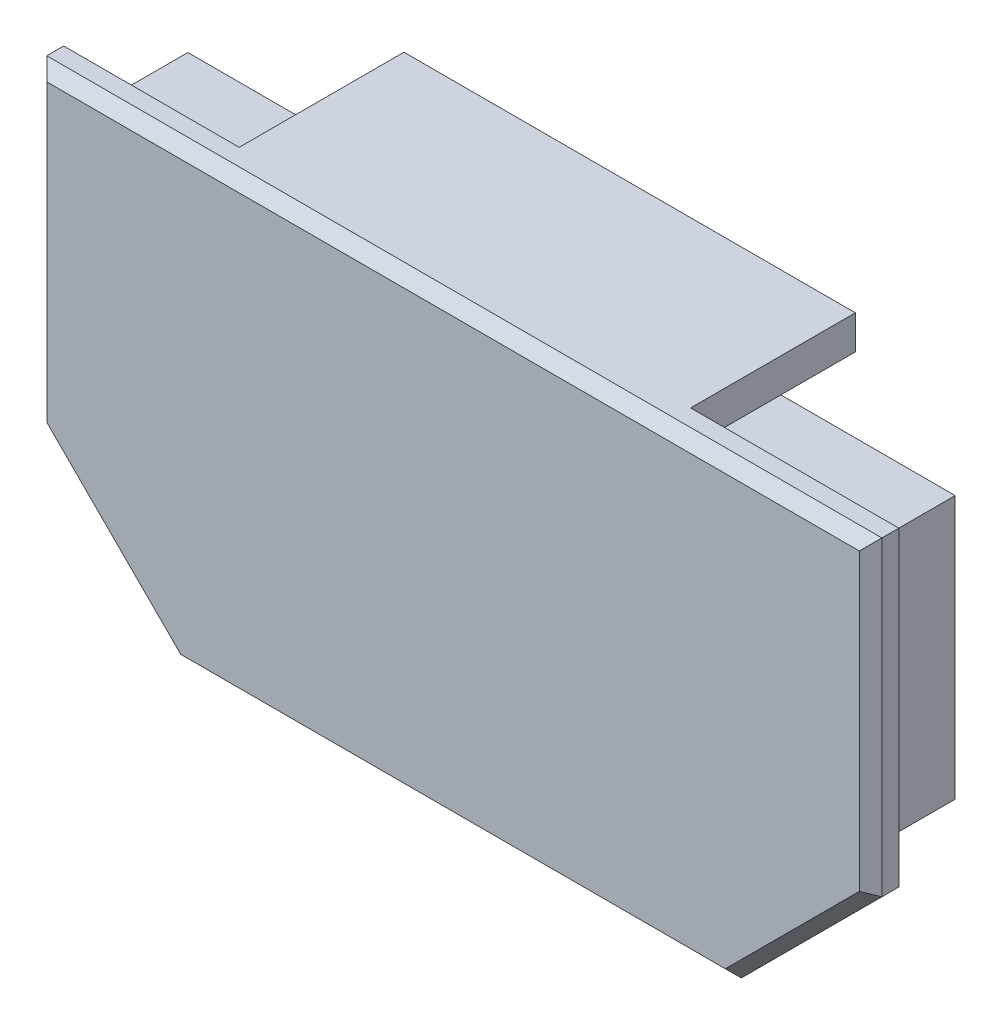
ISO-10303-21;
HEADER;
FILE_DESCRIPTION(('STEP AP214'),'2;1');
FILE_NAME('part.step','',(''),(''),'','','');
FILE_SCHEMA(('AUTOMOTIVE_DESIGN { 1 0 10303 214 1 1 1 1 }'));
ENDSEC;
DATA;
#1=APPLICATION_CONTEXT('core data for automotive mechanical design processes');
#2=APPLICATION_PROTOCOL_DEFINITION('international standard','automotive_design',2000,#1);
#3=PRODUCT_CONTEXT('',#1,'mechanical');
#4=PRODUCT('Part','Part','',(#3));
#5=PRODUCT_RELATED_PRODUCT_CATEGORY('part','',(#4));
#6=PRODUCT_DEFINITION_FORMATION('','',#4);
#7=PRODUCT_DEFINITION_CONTEXT('part definition',#1,'design');
#8=PRODUCT_DEFINITION('design','',#6,#7);
#9=PRODUCT_DEFINITION_SHAPE('','',#8);
#10=(LENGTH_UNIT() NAMED_UNIT(*) SI_UNIT(.MILLI.,.METRE.));
#11=(NAMED_UNIT(*) PLANE_ANGLE_UNIT() SI_UNIT($,.RADIAN.));
#12=(NAMED_UNIT(*) SI_UNIT($,.STERADIAN.) SOLID_ANGLE_UNIT());
#13=UNCERTAINTY_MEASURE_WITH_UNIT(LENGTH_MEASURE(1.E-05),#10,'distance_accuracy_value','');
#14=(GEOMETRIC_REPRESENTATION_CONTEXT(3) GLOBAL_UNCERTAINTY_ASSIGNED_CONTEXT((#13)) GLOBAL_UNIT_ASSIGNED_CONTEXT((#10,
#11,#12)) REPRESENTATION_CONTEXT('',''));
#15=CARTESIAN_POINT('',(0.,0.,0.));
#16=DIRECTION('',(0.,0.,1.));
#17=DIRECTION('',(1.,0.,0.));
#18=AXIS2_PLACEMENT_3D('',#15,#16,#17);
#19=CARTESIAN_POINT('',(-34.,17.,-8.));
#20=DIRECTION('',(0.,1.,0.));
#21=DIRECTION('',(0.,0.,1.));
#22=AXIS2_PLACEMENT_3D('',#19,#20,#21);
#23=PLANE('',#22);
#24=DIRECTION('',(-1.,0.,0.));
#25=VECTOR('',#24,1.);
#26=CARTESIAN_POINT('',(-34.,17.,-8.));
#27=LINE('',#26,#25);
#28=CARTESIAN_POINT('',(34.,17.,-8.));
#29=VERTEX_POINT('',#28);
#30=CARTESIAN_POINT('',(18.55,17.,-8.));
#31=VERTEX_POINT('',#30);
#32=EDGE_CURVE('E389',#29,#31,#27,.T.);
#33=ORIENTED_EDGE('',*,*,#32,.T.);
#34=DIRECTION('',(0.,0.,1.));
#35=VECTOR('',#34,1.);
#36=CARTESIAN_POINT('',(18.55,17.,-14.6));
#37=LINE('',#36,#35);
#38=CARTESIAN_POINT('',(18.55,17.,0.));
#39=VERTEX_POINT('',#38);
#40=EDGE_CURVE('E263',#31,#39,#37,.T.);
#41=ORIENTED_EDGE('',*,*,#40,.T.);
#42=DIRECTION('',(-1.,0.,0.));
#43=VECTOR('',#42,1.);
#44=CARTESIAN_POINT('',(-34.,17.,0.));
#45=LINE('',#44,#43);
#46=CARTESIAN_POINT('',(34.,17.,0.));
#47=VERTEX_POINT('',#46);
#48=EDGE_CURVE('E408',#47,#39,#45,.T.);
#49=ORIENTED_EDGE('',*,*,#48,.F.);
#50=DIRECTION('',(0.,0.,1.));
#51=VECTOR('',#50,1.);
#52=CARTESIAN_POINT('',(34.,17.,-8.));
#53=LINE('',#52,#51);
#54=EDGE_CURVE('E431',#29,#47,#53,.T.);
#55=ORIENTED_EDGE('',*,*,#54,.F.);
#56=EDGE_LOOP('',(#33,#41,#49,#55));
#57=FACE_BOUND('',#56,.T.);
#58=ADVANCED_FACE('F41',(#57),#23,.T.);
#59=CARTESIAN_POINT('',(-21.45,17.,0.));
#60=VERTEX_POINT('',#59);
#61=CARTESIAN_POINT('',(-34.,17.,0.));
#62=VERTEX_POINT('',#61);
#63=EDGE_CURVE('E407',#60,#62,#45,.T.);
#64=ORIENTED_EDGE('',*,*,#63,.F.);
#65=DIRECTION('',(0.,0.,1.));
#66=VECTOR('',#65,1.);
#67=CARTESIAN_POINT('',(-21.45,17.,-14.6));
#68=LINE('',#67,#66);
#69=CARTESIAN_POINT('',(-21.45,17.,-8.));
#70=VERTEX_POINT('',#69);
#71=EDGE_CURVE('E615',#70,#60,#68,.T.);
#72=ORIENTED_EDGE('',*,*,#71,.F.);
#73=CARTESIAN_POINT('',(-34.,17.,-8.));
#74=VERTEX_POINT('',#73);
#75=EDGE_CURVE('E388',#70,#74,#27,.T.);
#76=ORIENTED_EDGE('',*,*,#75,.T.);
#77=DIRECTION('',(0.,0.,1.));
#78=VECTOR('',#77,1.);
#79=CARTESIAN_POINT('',(-34.,17.,-8.));
#80=LINE('',#79,#78);
#81=EDGE_CURVE('E428',#74,#62,#80,.T.);
#82=ORIENTED_EDGE('',*,*,#81,.T.);
#83=EDGE_LOOP('',(#64,#72,#76,#82));
#84=FACE_BOUND('',#83,.T.);
#85=ADVANCED_FACE('F544',(#84),#23,.T.);
#86=CARTESIAN_POINT('',(0.,0.,0.));
#87=DIRECTION('',(0.,0.,1.));
#88=DIRECTION('',(1.,0.,0.));
#89=AXIS2_PLACEMENT_3D('',#86,#87,#88);
#90=PLANE('',#89);
#91=DIRECTION('',(0.,-1.,0.));
#92=VECTOR('',#91,1.);
#93=CARTESIAN_POINT('',(18.55,20.,0.));
#94=LINE('',#93,#92);
#95=CARTESIAN_POINT('',(18.55,20.,0.));
#96=VERTEX_POINT('',#95);
#97=EDGE_CURVE('E612',#96,#39,#94,.T.);
#98=ORIENTED_EDGE('',*,*,#97,.F.);
#99=DIRECTION('',(-1.,0.,0.));
#100=VECTOR('',#99,1.);
#101=CARTESIAN_POINT('',(-37.,20.,0.));
#102=LINE('',#101,#100);
#103=CARTESIAN_POINT('',(37.,20.,0.));
#104=VERTEX_POINT('',#103);
#105=EDGE_CURVE('E303',#104,#96,#102,.T.);
#106=ORIENTED_EDGE('',*,*,#105,.F.);
#107=DIRECTION('',(0.,1.,0.));
#108=VECTOR('',#107,1.);
#109=CARTESIAN_POINT('',(37.,-7.54264068711929,0.));
#110=LINE('',#109,#108);
#111=CARTESIAN_POINT('',(37.,-7.54264068711929,0.));
#112=VERTEX_POINT('',#111);
#113=EDGE_CURVE('E299',#112,#104,#110,.T.);
#114=ORIENTED_EDGE('',*,*,#113,.F.);
#115=DIRECTION('',(0.707106781186547,0.707106781186547,0.));
#116=VECTOR('',#115,1.);
#117=CARTESIAN_POINT('',(24.5426406871193,-20.,0.));
#118=LINE('',#117,#116);
#119=CARTESIAN_POINT('',(24.5426406871193,-20.,0.));
#120=VERTEX_POINT('',#119);
#121=EDGE_CURVE('E295',#120,#112,#118,.T.);
#122=ORIENTED_EDGE('',*,*,#121,.F.);
#123=DIRECTION('',(1.,0.,0.));
#124=VECTOR('',#123,1.);
#125=CARTESIAN_POINT('',(-24.5426406871193,-20.,0.));
#126=LINE('',#125,#124);
#127=CARTESIAN_POINT('',(4.,-20.,0.));
#128=VERTEX_POINT('',#127);
#129=EDGE_CURVE('E296',#128,#120,#126,.T.);
#130=ORIENTED_EDGE('',*,*,#129,.F.);
#131=DIRECTION('',(0.,-1.,0.));
#132=VECTOR('',#131,1.);
#133=CARTESIAN_POINT('',(4.,-8.93774225170146,0.));
#134=LINE('',#133,#132);
#135=CARTESIAN_POINT('',(4.,-17.,0.));
#136=VERTEX_POINT('',#135);
#137=EDGE_CURVE('E289',#136,#128,#134,.T.);
#138=ORIENTED_EDGE('',*,*,#137,.F.);
#139=DIRECTION('',(1.,0.,0.));
#140=VECTOR('',#139,1.);
#141=CARTESIAN_POINT('',(-23.3,-17.,0.));
#142=LINE('',#141,#140);
#143=CARTESIAN_POINT('',(23.3,-17.,0.));
#144=VERTEX_POINT('',#143);
#145=EDGE_CURVE('E417',#136,#144,#142,.T.);
#146=ORIENTED_EDGE('',*,*,#145,.T.);
#147=DIRECTION('',(0.707106781186547,0.707106781186547,0.));
#148=VECTOR('',#147,1.);
#149=CARTESIAN_POINT('',(23.3,-17.,0.));
#150=LINE('',#149,#148);
#151=CARTESIAN_POINT('',(34.,-6.30000000000001,0.));
#152=VERTEX_POINT('',#151);
#153=EDGE_CURVE('E366',#144,#152,#150,.T.);
#154=ORIENTED_EDGE('',*,*,#153,.T.);
#155=DIRECTION('',(0.,1.,0.));
#156=VECTOR('',#155,1.);
#157=CARTESIAN_POINT('',(34.,-6.30000000000001,0.));
#158=LINE('',#157,#156);
#159=EDGE_CURVE('E404',#152,#47,#158,.T.);
#160=ORIENTED_EDGE('',*,*,#159,.T.);
#161=ORIENTED_EDGE('',*,*,#48,.T.);
#162=EDGE_LOOP('',(#98,#106,#114,#122,#130,#138,#146,#154,#160,#161));
#163=FACE_BOUND('',#162,.T.);
#164=ADVANCED_FACE('F490',(#163),#90,.F.);
#165=DIRECTION('',(0.,1.,0.));
#166=VECTOR('',#165,1.);
#167=CARTESIAN_POINT('',(-21.45,20.,0.));
#168=LINE('',#167,#166);
#169=CARTESIAN_POINT('',(-21.45,20.,0.));
#170=VERTEX_POINT('',#169);
#171=EDGE_CURVE('E259',#60,#170,#168,.T.);
#172=ORIENTED_EDGE('',*,*,#171,.F.);
#173=ORIENTED_EDGE('',*,*,#63,.T.);
#174=DIRECTION('',(0.,-1.,0.));
#175=VECTOR('',#174,1.);
#176=CARTESIAN_POINT('',(-34.,17.,0.));
#177=LINE('',#176,#175);
#178=CARTESIAN_POINT('',(-34.,-6.30000000000002,0.));
#179=VERTEX_POINT('',#178);
#180=EDGE_CURVE('E411',#62,#179,#177,.T.);
#181=ORIENTED_EDGE('',*,*,#180,.T.);
#182=DIRECTION('',(0.707106781186548,-0.707106781186547,0.));
#183=VECTOR('',#182,1.);
#184=CARTESIAN_POINT('',(-34.,-6.30000000000002,0.));
#185=LINE('',#184,#183);
#186=CARTESIAN_POINT('',(-23.3,-17.,0.));
#187=VERTEX_POINT('',#186);
#188=EDGE_CURVE('E414',#179,#187,#185,.T.);
#189=ORIENTED_EDGE('',*,*,#188,.T.);
#190=CARTESIAN_POINT('',(-4.,-17.,0.));
#191=VERTEX_POINT('',#190);
#192=EDGE_CURVE('E385',#187,#191,#142,.T.);
#193=ORIENTED_EDGE('',*,*,#192,.T.);
#194=DIRECTION('',(0.,-1.,0.));
#195=VECTOR('',#194,1.);
#196=CARTESIAN_POINT('',(-4.,-8.93774225170146,0.));
#197=LINE('',#196,#195);
#198=CARTESIAN_POINT('',(-4.,-20.,0.));
#199=VERTEX_POINT('',#198);
#200=EDGE_CURVE('E67',#191,#199,#197,.T.);
#201=ORIENTED_EDGE('',*,*,#200,.T.);
#202=CARTESIAN_POINT('',(-24.5426406871193,-20.,0.));
#203=VERTEX_POINT('',#202);
#204=EDGE_CURVE('E292',#203,#199,#126,.T.);
#205=ORIENTED_EDGE('',*,*,#204,.F.);
#206=DIRECTION('',(0.707106781186547,-0.707106781186547,0.));
#207=VECTOR('',#206,1.);
#208=CARTESIAN_POINT('',(-37.,-7.54264068711929,0.));
#209=LINE('',#208,#207);
#210=CARTESIAN_POINT('',(-37.,-7.54264068711929,0.));
#211=VERTEX_POINT('',#210);
#212=EDGE_CURVE('E309',#211,#203,#209,.T.);
#213=ORIENTED_EDGE('',*,*,#212,.F.);
#214=DIRECTION('',(0.,-1.,0.));
#215=VECTOR('',#214,1.);
#216=CARTESIAN_POINT('',(-37.,20.,0.));
#217=LINE('',#216,#215);
#218=CARTESIAN_POINT('',(-37.,20.,0.));
#219=VERTEX_POINT('',#218);
#220=EDGE_CURVE('E306',#219,#211,#217,.T.);
#221=ORIENTED_EDGE('',*,*,#220,.F.);
#222=EDGE_CURVE('E302',#170,#219,#102,.T.);
#223=ORIENTED_EDGE('',*,*,#222,.F.);
#224=EDGE_LOOP('',(#172,#173,#181,#189,#193,#201,#205,#213,#221,#223));
#225=FACE_BOUND('',#224,.T.);
#226=ADVANCED_FACE('F565',(#225),#90,.F.);
#227=CARTESIAN_POINT('',(23.3,-17.,-8.));
#228=DIRECTION('',(0.707106781186547,-0.707106781186547,0.));
#229=DIRECTION('',(0.707106781186548,0.707106781186548,0.));
#230=AXIS2_PLACEMENT_3D('',#227,#228,#229);
#231=PLANE('',#230);
#232=ORIENTED_EDGE('',*,*,#153,.F.);
#233=DIRECTION('',(0.,0.,1.));
#234=VECTOR('',#233,1.);
#235=CARTESIAN_POINT('',(23.3,-17.,-8.));
#236=LINE('',#235,#234);
#237=CARTESIAN_POINT('',(23.3,-17.,-8.));
#238=VERTEX_POINT('',#237);
#239=EDGE_CURVE('E420',#238,#144,#236,.T.);
#240=ORIENTED_EDGE('',*,*,#239,.F.);
#241=DIRECTION('',(0.707106781186547,0.707106781186547,0.));
#242=VECTOR('',#241,1.);
#243=CARTESIAN_POINT('',(23.3,-17.,-8.));
#244=LINE('',#243,#242);
#245=CARTESIAN_POINT('',(34.,-6.30000000000001,-8.));
#246=VERTEX_POINT('',#245);
#247=EDGE_CURVE('E381',#238,#246,#244,.T.);
#248=ORIENTED_EDGE('',*,*,#247,.T.);
#249=DIRECTION('',(0.,0.,1.));
#250=VECTOR('',#249,1.);
#251=CARTESIAN_POINT('',(34.,-6.30000000000001,-8.));
#252=LINE('',#251,#250);
#253=EDGE_CURVE('E401',#246,#152,#252,.T.);
#254=ORIENTED_EDGE('',*,*,#253,.T.);
#255=EDGE_LOOP('',(#232,#240,#248,#254));
#256=FACE_BOUND('',#255,.T.);
#257=ADVANCED_FACE('F561',(#256),#231,.T.);
#258=CARTESIAN_POINT('',(-23.3,-17.,-8.));
#259=DIRECTION('',(0.,-1.,0.));
#260=DIRECTION('',(1.,0.,0.));
#261=AXIS2_PLACEMENT_3D('',#258,#259,#260);
#262=PLANE('',#261);
#263=ORIENTED_EDGE('',*,*,#192,.F.);
#264=DIRECTION('',(0.,0.,1.));
#265=VECTOR('',#264,1.);
#266=CARTESIAN_POINT('',(-23.3,-17.,-8.));
#267=LINE('',#266,#265);
#268=CARTESIAN_POINT('',(-23.3,-17.,-8.));
#269=VERTEX_POINT('',#268);
#270=EDGE_CURVE('E424',#269,#187,#267,.T.);
#271=ORIENTED_EDGE('',*,*,#270,.F.);
#272=DIRECTION('',(1.,0.,0.));
#273=VECTOR('',#272,1.);
#274=CARTESIAN_POINT('',(-23.3,-17.,-8.));
#275=LINE('',#274,#273);
#276=EDGE_CURVE('E398',#269,#238,#275,.T.);
#277=ORIENTED_EDGE('',*,*,#276,.T.);
#278=ORIENTED_EDGE('',*,*,#239,.T.);
#279=ORIENTED_EDGE('',*,*,#145,.F.);
#280=DIRECTION('',(0.866025403784442,0.,-0.499999999999995));
#281=VECTOR('',#280,1.);
#282=CARTESIAN_POINT('',(4.,-17.,0.));
#283=LINE('',#282,#281);
#284=CARTESIAN_POINT('',(2.2679491924311,-17.,1.));
#285=VERTEX_POINT('',#284);
#286=EDGE_CURVE('E271',#285,#136,#283,.T.);
#287=ORIENTED_EDGE('',*,*,#286,.F.);
#288=DIRECTION('',(1.,0.,0.));
#289=VECTOR('',#288,1.);
#290=CARTESIAN_POINT('',(2.2679491924311,-17.,1.));
#291=LINE('',#290,#289);
#292=CARTESIAN_POINT('',(-2.2679491924311,-17.,1.));
#293=VERTEX_POINT('',#292);
#294=EDGE_CURVE('E273',#293,#285,#291,.T.);
#295=ORIENTED_EDGE('',*,*,#294,.F.);
#296=DIRECTION('',(0.866025403784442,0.,0.499999999999995));
#297=VECTOR('',#296,1.);
#298=CARTESIAN_POINT('',(-2.2679491924311,-17.,1.));
#299=LINE('',#298,#297);
#300=EDGE_CURVE('E276',#191,#293,#299,.T.);
#301=ORIENTED_EDGE('',*,*,#300,.F.);
#302=EDGE_LOOP('',(#263,#271,#277,#278,#279,#287,#295,#301));
#303=FACE_BOUND('',#302,.T.);
#304=ADVANCED_FACE('F564',(#303),#262,.T.);
#305=CARTESIAN_POINT('',(-34.,-6.30000000000002,-8.));
#306=DIRECTION('',(-0.707106781186547,-0.707106781186548,0.));
#307=DIRECTION('',(0.707106781186548,-0.707106781186547,0.));
#308=AXIS2_PLACEMENT_3D('',#305,#306,#307);
#309=PLANE('',#308);
#310=ORIENTED_EDGE('',*,*,#188,.F.);
#311=DIRECTION('',(0.,0.,1.));
#312=VECTOR('',#311,1.);
#313=CARTESIAN_POINT('',(-34.,-6.30000000000002,-8.));
#314=LINE('',#313,#312);
#315=CARTESIAN_POINT('',(-34.,-6.30000000000002,-8.));
#316=VERTEX_POINT('',#315);
#317=EDGE_CURVE('E426',#316,#179,#314,.T.);
#318=ORIENTED_EDGE('',*,*,#317,.F.);
#319=DIRECTION('',(0.707106781186548,-0.707106781186547,0.));
#320=VECTOR('',#319,1.);
#321=CARTESIAN_POINT('',(-34.,-6.30000000000002,-8.));
#322=LINE('',#321,#320);
#323=EDGE_CURVE('E395',#316,#269,#322,.T.);
#324=ORIENTED_EDGE('',*,*,#323,.T.);
#325=ORIENTED_EDGE('',*,*,#270,.T.);
#326=EDGE_LOOP('',(#310,#318,#324,#325));
#327=FACE_BOUND('',#326,.T.);
#328=ADVANCED_FACE('F624',(#327),#309,.T.);
#329=CARTESIAN_POINT('',(-34.,17.,-8.));
#330=DIRECTION('',(-1.,0.,0.));
#331=DIRECTION('',(0.,-1.,0.));
#332=AXIS2_PLACEMENT_3D('',#329,#330,#331);
#333=PLANE('',#332);
#334=ORIENTED_EDGE('',*,*,#180,.F.);
#335=ORIENTED_EDGE('',*,*,#81,.F.);
#336=DIRECTION('',(0.,-1.,0.));
#337=VECTOR('',#336,1.);
#338=CARTESIAN_POINT('',(-34.,17.,-8.));
#339=LINE('',#338,#337);
#340=EDGE_CURVE('E392',#74,#316,#339,.T.);
#341=ORIENTED_EDGE('',*,*,#340,.T.);
#342=ORIENTED_EDGE('',*,*,#317,.T.);
#343=EDGE_LOOP('',(#334,#335,#341,#342));
#344=FACE_BOUND('',#343,.T.);
#345=ADVANCED_FACE('F554',(#344),#333,.T.);
#346=CARTESIAN_POINT('',(34.,-6.30000000000001,-8.));
#347=DIRECTION('',(1.,0.,0.));
#348=DIRECTION('',(0.,0.,-1.));
#349=AXIS2_PLACEMENT_3D('',#346,#347,#348);
#350=PLANE('',#349);
#351=ORIENTED_EDGE('',*,*,#159,.F.);
#352=ORIENTED_EDGE('',*,*,#253,.F.);
#353=DIRECTION('',(0.,1.,0.));
#354=VECTOR('',#353,1.);
#355=CARTESIAN_POINT('',(34.,-6.30000000000001,-8.));
#356=LINE('',#355,#354);
#357=EDGE_CURVE('E384',#246,#29,#356,.T.);
#358=ORIENTED_EDGE('',*,*,#357,.T.);
#359=ORIENTED_EDGE('',*,*,#54,.T.);
#360=EDGE_LOOP('',(#351,#352,#358,#359));
#361=FACE_BOUND('',#360,.T.);
#362=ADVANCED_FACE('F556',(#361),#350,.T.);
#363=CARTESIAN_POINT('',(0.,0.,-8.));
#364=DIRECTION('',(0.,0.,-1.));
#365=DIRECTION('',(-1.,0.,0.));
#366=AXIS2_PLACEMENT_3D('',#363,#364,#365);
#367=PLANE('',#366);
#368=DIRECTION('',(0.707106781186548,0.707106781186548,0.));
#369=VECTOR('',#368,1.);
#370=CARTESIAN_POINT('',(22.4715728752538,-15.,-8.));
#371=LINE('',#370,#369);
#372=CARTESIAN_POINT('',(22.4715728752538,-15.,-8.));
#373=VERTEX_POINT('',#372);
#374=CARTESIAN_POINT('',(32.,-5.47157287525382,-8.));
#375=VERTEX_POINT('',#374);
#376=EDGE_CURVE('E327',#373,#375,#371,.T.);
#377=ORIENTED_EDGE('',*,*,#376,.T.);
#378=DIRECTION('',(0.,1.,0.));
#379=VECTOR('',#378,1.);
#380=CARTESIAN_POINT('',(32.,-5.47157287525382,-8.));
#381=LINE('',#380,#379);
#382=CARTESIAN_POINT('',(32.,15.,-8.));
#383=VERTEX_POINT('',#382);
#384=EDGE_CURVE('E330',#375,#383,#381,.T.);
#385=ORIENTED_EDGE('',*,*,#384,.T.);
#386=DIRECTION('',(-1.,0.,0.));
#387=VECTOR('',#386,1.);
#388=CARTESIAN_POINT('',(-32.,15.,-8.));
#389=LINE('',#388,#387);
#390=CARTESIAN_POINT('',(-32.,15.,-8.));
#391=VERTEX_POINT('',#390);
#392=EDGE_CURVE('E334',#383,#391,#389,.T.);
#393=ORIENTED_EDGE('',*,*,#392,.T.);
#394=DIRECTION('',(0.,-1.,0.));
#395=VECTOR('',#394,1.);
#396=CARTESIAN_POINT('',(-32.,15.,-8.));
#397=LINE('',#396,#395);
#398=CARTESIAN_POINT('',(-32.,-5.47157287525383,-8.));
#399=VERTEX_POINT('',#398);
#400=EDGE_CURVE('E337',#391,#399,#397,.T.);
#401=ORIENTED_EDGE('',*,*,#400,.T.);
#402=DIRECTION('',(0.707106781186548,-0.707106781186547,0.));
#403=VECTOR('',#402,1.);
#404=CARTESIAN_POINT('',(-32.,-5.47157287525383,-8.));
#405=LINE('',#404,#403);
#406=CARTESIAN_POINT('',(-22.4715728752538,-15.,-8.));
#407=VERTEX_POINT('',#406);
#408=EDGE_CURVE('E340',#399,#407,#405,.T.);
#409=ORIENTED_EDGE('',*,*,#408,.T.);
#410=DIRECTION('',(1.,0.,0.));
#411=VECTOR('',#410,1.);
#412=CARTESIAN_POINT('',(-22.4715728752538,-15.,-8.));
#413=LINE('',#412,#411);
#414=EDGE_CURVE('E343',#407,#373,#413,.T.);
#415=ORIENTED_EDGE('',*,*,#414,.T.);
#416=EDGE_LOOP('',(#377,#385,#393,#401,#409,#415));
#417=FACE_BOUND('',#416,.T.);
#418=ORIENTED_EDGE('',*,*,#247,.F.);
#419=ORIENTED_EDGE('',*,*,#276,.F.);
#420=ORIENTED_EDGE('',*,*,#323,.F.);
#421=ORIENTED_EDGE('',*,*,#340,.F.);
#422=ORIENTED_EDGE('',*,*,#75,.F.);
#423=DIRECTION('',(1.,0.,0.));
#424=VECTOR('',#423,1.);
#425=CARTESIAN_POINT('',(0.,17.,-8.));
#426=LINE('',#425,#424);
#427=EDGE_CURVE('E264',#70,#31,#426,.T.);
#428=ORIENTED_EDGE('',*,*,#427,.T.);
#429=ORIENTED_EDGE('',*,*,#32,.F.);
#430=ORIENTED_EDGE('',*,*,#357,.F.);
#431=EDGE_LOOP('',(#418,#419,#420,#421,#422,#428,#429,#430));
#432=FACE_BOUND('',#431,.T.);
#433=ADVANCED_FACE('F559',(#417,#432),#367,.T.);
#434=CARTESIAN_POINT('',(22.4715728752538,-15.,-8.));
#435=DIRECTION('',(0.707106781186547,-0.707106781186547,0.));
#436=DIRECTION('',(0.707106781186548,0.707106781186548,0.));
#437=AXIS2_PLACEMENT_3D('',#434,#435,#436);
#438=PLANE('',#437);
#439=DIRECTION('',(0.707106781186548,0.707106781186548,0.));
#440=VECTOR('',#439,1.);
#441=CARTESIAN_POINT('',(22.4715728752538,-15.,0.));
#442=LINE('',#441,#440);
#443=CARTESIAN_POINT('',(22.4715728752538,-15.,0.));
#444=VERTEX_POINT('',#443);
#445=CARTESIAN_POINT('',(32.,-5.47157287525382,0.));
#446=VERTEX_POINT('',#445);
#447=EDGE_CURVE('E326',#444,#446,#442,.T.);
#448=ORIENTED_EDGE('',*,*,#447,.T.);
#449=DIRECTION('',(0.,0.,1.));
#450=VECTOR('',#449,1.);
#451=CARTESIAN_POINT('',(32.,-5.47157287525382,-8.));
#452=LINE('',#451,#450);
#453=EDGE_CURVE('E346',#375,#446,#452,.T.);
#454=ORIENTED_EDGE('',*,*,#453,.F.);
#455=ORIENTED_EDGE('',*,*,#376,.F.);
#456=DIRECTION('',(0.,0.,1.));
#457=VECTOR('',#456,1.);
#458=CARTESIAN_POINT('',(22.4715728752538,-15.,-8.));
#459=LINE('',#458,#457);
#460=EDGE_CURVE('E363',#373,#444,#459,.T.);
#461=ORIENTED_EDGE('',*,*,#460,.T.);
#462=EDGE_LOOP('',(#448,#454,#455,#461));
#463=FACE_BOUND('',#462,.T.);
#464=ADVANCED_FACE('F739',(#463),#438,.F.);
#465=CARTESIAN_POINT('',(-22.4715728752538,-15.,-8.));
#466=DIRECTION('',(0.,-1.,0.));
#467=DIRECTION('',(1.,0.,0.));
#468=AXIS2_PLACEMENT_3D('',#465,#466,#467);
#469=PLANE('',#468);
#470=DIRECTION('',(1.,0.,0.));
#471=VECTOR('',#470,1.);
#472=CARTESIAN_POINT('',(-22.4715728752538,-15.,0.));
#473=LINE('',#472,#471);
#474=CARTESIAN_POINT('',(-22.4715728752538,-15.,0.));
#475=VERTEX_POINT('',#474);
#476=EDGE_CURVE('E331',#475,#444,#473,.T.);
#477=ORIENTED_EDGE('',*,*,#476,.T.);
#478=ORIENTED_EDGE('',*,*,#460,.F.);
#479=ORIENTED_EDGE('',*,*,#414,.F.);
#480=DIRECTION('',(0.,0.,1.));
#481=VECTOR('',#480,1.);
#482=CARTESIAN_POINT('',(-22.4715728752538,-15.,-8.));
#483=LINE('',#482,#481);
#484=EDGE_CURVE('E367',#407,#475,#483,.T.);
#485=ORIENTED_EDGE('',*,*,#484,.T.);
#486=EDGE_LOOP('',(#477,#478,#479,#485));
#487=FACE_BOUND('',#486,.T.);
#488=ADVANCED_FACE('F757',(#487),#469,.F.);
#489=CARTESIAN_POINT('',(-32.,-5.47157287525383,-8.));
#490=DIRECTION('',(-0.707106781186547,-0.707106781186548,0.));
#491=DIRECTION('',(0.707106781186548,-0.707106781186547,0.));
#492=AXIS2_PLACEMENT_3D('',#489,#490,#491);
#493=PLANE('',#492);
#494=DIRECTION('',(0.707106781186548,-0.707106781186547,0.));
#495=VECTOR('',#494,1.);
#496=CARTESIAN_POINT('',(-32.,-5.47157287525383,0.));
#497=LINE('',#496,#495);
#498=CARTESIAN_POINT('',(-32.,-5.47157287525383,0.));
#499=VERTEX_POINT('',#498);
#500=EDGE_CURVE('E358',#499,#475,#497,.T.);
#501=ORIENTED_EDGE('',*,*,#500,.T.);
#502=ORIENTED_EDGE('',*,*,#484,.F.);
#503=ORIENTED_EDGE('',*,*,#408,.F.);
#504=DIRECTION('',(0.,0.,1.));
#505=VECTOR('',#504,1.);
#506=CARTESIAN_POINT('',(-32.,-5.47157287525383,-8.));
#507=LINE('',#506,#505);
#508=EDGE_CURVE('E370',#399,#499,#507,.T.);
#509=ORIENTED_EDGE('',*,*,#508,.T.);
#510=EDGE_LOOP('',(#501,#502,#503,#509));
#511=FACE_BOUND('',#510,.T.);
#512=ADVANCED_FACE('F767',(#511),#493,.F.);
#513=CARTESIAN_POINT('',(-32.,15.,-8.));
#514=DIRECTION('',(-1.,0.,0.));
#515=DIRECTION('',(0.,-1.,0.));
#516=AXIS2_PLACEMENT_3D('',#513,#514,#515);
#517=PLANE('',#516);
#518=DIRECTION('',(0.,-1.,0.));
#519=VECTOR('',#518,1.);
#520=CARTESIAN_POINT('',(-32.,15.,0.));
#521=LINE('',#520,#519);
#522=CARTESIAN_POINT('',(-32.,15.,0.));
#523=VERTEX_POINT('',#522);
#524=EDGE_CURVE('E355',#523,#499,#521,.T.);
#525=ORIENTED_EDGE('',*,*,#524,.T.);
#526=ORIENTED_EDGE('',*,*,#508,.F.);
#527=ORIENTED_EDGE('',*,*,#400,.F.);
#528=DIRECTION('',(0.,0.,1.));
#529=VECTOR('',#528,1.);
#530=CARTESIAN_POINT('',(-32.,15.,-8.));
#531=LINE('',#530,#529);
#532=EDGE_CURVE('E373',#391,#523,#531,.T.);
#533=ORIENTED_EDGE('',*,*,#532,.T.);
#534=EDGE_LOOP('',(#525,#526,#527,#533));
#535=FACE_BOUND('',#534,.T.);
#536=ADVANCED_FACE('F777',(#535),#517,.F.);
#537=CARTESIAN_POINT('',(-32.,15.,-8.));
#538=DIRECTION('',(0.,1.,0.));
#539=DIRECTION('',(0.,0.,1.));
#540=AXIS2_PLACEMENT_3D('',#537,#538,#539);
#541=PLANE('',#540);
#542=DIRECTION('',(-1.,0.,0.));
#543=VECTOR('',#542,1.);
#544=CARTESIAN_POINT('',(-32.,15.,0.));
#545=LINE('',#544,#543);
#546=CARTESIAN_POINT('',(32.,15.,0.));
#547=VERTEX_POINT('',#546);
#548=EDGE_CURVE('E352',#547,#523,#545,.T.);
#549=ORIENTED_EDGE('',*,*,#548,.T.);
#550=ORIENTED_EDGE('',*,*,#532,.F.);
#551=ORIENTED_EDGE('',*,*,#392,.F.);
#552=DIRECTION('',(0.,0.,1.));
#553=VECTOR('',#552,1.);
#554=CARTESIAN_POINT('',(32.,15.,-8.));
#555=LINE('',#554,#553);
#556=EDGE_CURVE('E376',#383,#547,#555,.T.);
#557=ORIENTED_EDGE('',*,*,#556,.T.);
#558=EDGE_LOOP('',(#549,#550,#551,#557));
#559=FACE_BOUND('',#558,.T.);
#560=ADVANCED_FACE('F538',(#559),#541,.F.);
#561=CARTESIAN_POINT('',(32.,-5.47157287525382,-8.));
#562=DIRECTION('',(1.,0.,0.));
#563=DIRECTION('',(0.,1.,0.));
#564=AXIS2_PLACEMENT_3D('',#561,#562,#563);
#565=PLANE('',#564);
#566=DIRECTION('',(0.,1.,0.));
#567=VECTOR('',#566,1.);
#568=CARTESIAN_POINT('',(32.,-5.47157287525382,0.));
#569=LINE('',#568,#567);
#570=EDGE_CURVE('E349',#446,#547,#569,.T.);
#571=ORIENTED_EDGE('',*,*,#570,.T.);
#572=ORIENTED_EDGE('',*,*,#556,.F.);
#573=ORIENTED_EDGE('',*,*,#384,.F.);
#574=ORIENTED_EDGE('',*,*,#453,.T.);
#575=EDGE_LOOP('',(#571,#572,#573,#574));
#576=FACE_BOUND('',#575,.T.);
#577=ADVANCED_FACE('F530',(#576),#565,.F.);
#578=CARTESIAN_POINT('',(0.,0.,2.5));
#579=DIRECTION('',(0.,0.,1.));
#580=DIRECTION('',(1.,0.,0.));
#581=AXIS2_PLACEMENT_3D('',#578,#579,#580);
#582=PLANE('',#581);
#583=DIRECTION('',(0.,-1.,0.));
#584=VECTOR('',#583,1.);
#585=CARTESIAN_POINT('',(-36.,-7.54264068711929,2.5));
#586=LINE('',#585,#584);
#587=CARTESIAN_POINT('',(-36.,19.,2.5));
#588=VERTEX_POINT('',#587);
#589=CARTESIAN_POINT('',(-36.,-7.12842712474619,2.5));
#590=VERTEX_POINT('',#589);
#591=EDGE_CURVE('E441',#588,#590,#586,.T.);
#592=ORIENTED_EDGE('',*,*,#591,.T.);
#593=DIRECTION('',(0.707106781186548,-0.707106781186548,0.));
#594=VECTOR('',#593,1.);
#595=CARTESIAN_POINT('',(-23.8355339059327,-19.2928932188134,2.5));
#596=LINE('',#595,#594);
#597=CARTESIAN_POINT('',(-24.1284271247462,-19.,2.5));
#598=VERTEX_POINT('',#597);
#599=EDGE_CURVE('E443',#590,#598,#596,.T.);
#600=ORIENTED_EDGE('',*,*,#599,.T.);
#601=DIRECTION('',(1.,0.,0.));
#602=VECTOR('',#601,1.);
#603=CARTESIAN_POINT('',(24.5426406871193,-19.,2.5));
#604=LINE('',#603,#602);
#605=CARTESIAN_POINT('',(24.1284271247462,-19.,2.5));
#606=VERTEX_POINT('',#605);
#607=EDGE_CURVE('E423',#598,#606,#604,.T.);
#608=ORIENTED_EDGE('',*,*,#607,.T.);
#609=DIRECTION('',(0.707106781186548,0.707106781186548,0.));
#610=VECTOR('',#609,1.);
#611=CARTESIAN_POINT('',(36.2928932188134,-6.83553390593273,2.5));
#612=LINE('',#611,#610);
#613=CARTESIAN_POINT('',(36.,-7.12842712474618,2.5));
#614=VERTEX_POINT('',#613);
#615=EDGE_CURVE('E435',#606,#614,#612,.T.);
#616=ORIENTED_EDGE('',*,*,#615,.T.);
#617=DIRECTION('',(0.,1.,0.));
#618=VECTOR('',#617,1.);
#619=CARTESIAN_POINT('',(36.,20.,2.5));
#620=LINE('',#619,#618);
#621=CARTESIAN_POINT('',(36.,19.,2.5));
#622=VERTEX_POINT('',#621);
#623=EDGE_CURVE('E437',#614,#622,#620,.T.);
#624=ORIENTED_EDGE('',*,*,#623,.T.);
#625=DIRECTION('',(-1.,0.,0.));
#626=VECTOR('',#625,1.);
#627=CARTESIAN_POINT('',(-37.,19.,2.5));
#628=LINE('',#627,#626);
#629=EDGE_CURVE('E439',#622,#588,#628,.T.);
#630=ORIENTED_EDGE('',*,*,#629,.T.);
#631=EDGE_LOOP('',(#592,#600,#608,#616,#624,#630));
#632=FACE_BOUND('',#631,.T.);
#633=ADVANCED_FACE('F528',(#632),#582,.T.);
#634=CARTESIAN_POINT('',(-37.,-7.54264068711929,2.5));
#635=DIRECTION('',(0.707106781186548,0.707106781186548,0.));
#636=DIRECTION('',(-0.707106781186548,0.707106781186548,0.));
#637=AXIS2_PLACEMENT_3D('',#634,#635,#636);
#638=PLANE('',#637);
#639=DIRECTION('',(0.,0.,-1.));
#640=VECTOR('',#639,1.);
#641=CARTESIAN_POINT('',(-24.5426406871193,-20.,2.5));
#642=LINE('',#641,#640);
#643=CARTESIAN_POINT('',(-24.5426406871193,-20.,1.49999999999998));
#644=VERTEX_POINT('',#643);
#645=EDGE_CURVE('E312',#644,#203,#642,.T.);
#646=ORIENTED_EDGE('',*,*,#645,.F.);
#647=DIRECTION('',(-0.707106781186548,0.707106781186548,0.));
#648=VECTOR('',#647,1.);
#649=CARTESIAN_POINT('',(-37.,-7.54264068711929,1.49999999999998));
#650=LINE('',#649,#648);
#651=CARTESIAN_POINT('',(-37.,-7.54264068711929,1.49999999999998));
#652=VERTEX_POINT('',#651);
#653=EDGE_CURVE('E446',#644,#652,#650,.T.);
#654=ORIENTED_EDGE('',*,*,#653,.T.);
#655=DIRECTION('',(0.,0.,-1.));
#656=VECTOR('',#655,1.);
#657=CARTESIAN_POINT('',(-37.,-7.54264068711929,2.5));
#658=LINE('',#657,#656);
#659=EDGE_CURVE('E314',#652,#211,#658,.T.);
#660=ORIENTED_EDGE('',*,*,#659,.T.);
#661=ORIENTED_EDGE('',*,*,#212,.T.);
#662=EDGE_LOOP('',(#646,#654,#660,#661));
#663=FACE_BOUND('',#662,.T.);
#664=ADVANCED_FACE('F507',(#663),#638,.F.);
#665=CARTESIAN_POINT('',(-37.,20.,2.5));
#666=DIRECTION('',(1.,0.,0.));
#667=DIRECTION('',(0.,0.,-1.));
#668=AXIS2_PLACEMENT_3D('',#665,#666,#667);
#669=PLANE('',#668);
#670=ORIENTED_EDGE('',*,*,#659,.F.);
#671=DIRECTION('',(0.,1.,0.));
#672=VECTOR('',#671,1.);
#673=CARTESIAN_POINT('',(-37.,20.,1.49999999999998));
#674=LINE('',#673,#672);
#675=CARTESIAN_POINT('',(-37.,20.,1.49999999999998));
#676=VERTEX_POINT('',#675);
#677=EDGE_CURVE('E449',#652,#676,#674,.T.);
#678=ORIENTED_EDGE('',*,*,#677,.T.);
#679=DIRECTION('',(0.,0.,-1.));
#680=VECTOR('',#679,1.);
#681=CARTESIAN_POINT('',(-37.,20.,2.5));
#682=LINE('',#681,#680);
#683=EDGE_CURVE('E316',#676,#219,#682,.T.);
#684=ORIENTED_EDGE('',*,*,#683,.T.);
#685=ORIENTED_EDGE('',*,*,#220,.T.);
#686=EDGE_LOOP('',(#670,#678,#684,#685));
#687=FACE_BOUND('',#686,.T.);
#688=ADVANCED_FACE('F522',(#687),#669,.F.);
#689=CARTESIAN_POINT('',(-37.,20.,2.5));
#690=DIRECTION('',(0.,-1.,0.));
#691=DIRECTION('',(0.,0.,-1.));
#692=AXIS2_PLACEMENT_3D('',#689,#690,#691);
#693=PLANE('',#692);
#694=ORIENTED_EDGE('',*,*,#683,.F.);
#695=DIRECTION('',(1.,0.,0.));
#696=VECTOR('',#695,1.);
#697=CARTESIAN_POINT('',(37.,20.,1.49999999999998));
#698=LINE('',#697,#696);
#699=CARTESIAN_POINT('',(37.,20.,1.49999999999998));
#700=VERTEX_POINT('',#699);
#701=EDGE_CURVE('E451',#676,#700,#698,.T.);
#702=ORIENTED_EDGE('',*,*,#701,.T.);
#703=DIRECTION('',(0.,0.,-1.));
#704=VECTOR('',#703,1.);
#705=CARTESIAN_POINT('',(37.,20.,2.5));
#706=LINE('',#705,#704);
#707=EDGE_CURVE('E319',#700,#104,#706,.T.);
#708=ORIENTED_EDGE('',*,*,#707,.T.);
#709=ORIENTED_EDGE('',*,*,#105,.T.);
#710=DIRECTION('',(0.,0.,1.));
#711=VECTOR('',#710,1.);
#712=CARTESIAN_POINT('',(18.55,20.,-14.6));
#713=LINE('',#712,#711);
#714=CARTESIAN_POINT('',(18.55,20.,-14.6));
#715=VERTEX_POINT('',#714);
#716=EDGE_CURVE('E646',#715,#96,#713,.T.);
#717=ORIENTED_EDGE('',*,*,#716,.F.);
#718=DIRECTION('',(1.,0.,0.));
#719=VECTOR('',#718,1.);
#720=CARTESIAN_POINT('',(18.55,20.,-14.6));
#721=LINE('',#720,#719);
#722=CARTESIAN_POINT('',(-21.45,20.,-14.6));
#723=VERTEX_POINT('',#722);
#724=EDGE_CURVE('E256',#723,#715,#721,.T.);
#725=ORIENTED_EDGE('',*,*,#724,.F.);
#726=DIRECTION('',(0.,0.,1.));
#727=VECTOR('',#726,1.);
#728=CARTESIAN_POINT('',(-21.45,20.,-14.6));
#729=LINE('',#728,#727);
#730=EDGE_CURVE('E59',#723,#170,#729,.T.);
#731=ORIENTED_EDGE('',*,*,#730,.T.);
#732=ORIENTED_EDGE('',*,*,#222,.T.);
#733=EDGE_LOOP('',(#694,#702,#708,#709,#717,#725,#731,#732));
#734=FACE_BOUND('',#733,.T.);
#735=ADVANCED_FACE('F524',(#734),#693,.F.);
#736=CARTESIAN_POINT('',(37.,-7.54264068711929,2.5));
#737=DIRECTION('',(-1.,0.,0.));
#738=DIRECTION('',(0.,0.,1.));
#739=AXIS2_PLACEMENT_3D('',#736,#737,#738);
#740=PLANE('',#739);
#741=ORIENTED_EDGE('',*,*,#707,.F.);
#742=DIRECTION('',(0.,-1.,0.));
#743=VECTOR('',#742,1.);
#744=CARTESIAN_POINT('',(37.,-7.54264068711929,1.49999999999998));
#745=LINE('',#744,#743);
#746=CARTESIAN_POINT('',(37.,-7.54264068711929,1.49999999999998));
#747=VERTEX_POINT('',#746);
#748=EDGE_CURVE('E453',#700,#747,#745,.T.);
#749=ORIENTED_EDGE('',*,*,#748,.T.);
#750=DIRECTION('',(0.,0.,-1.));
#751=VECTOR('',#750,1.);
#752=CARTESIAN_POINT('',(37.,-7.54264068711929,2.5));
#753=LINE('',#752,#751);
#754=EDGE_CURVE('E321',#747,#112,#753,.T.);
#755=ORIENTED_EDGE('',*,*,#754,.T.);
#756=ORIENTED_EDGE('',*,*,#113,.T.);
#757=EDGE_LOOP('',(#741,#749,#755,#756));
#758=FACE_BOUND('',#757,.T.);
#759=ADVANCED_FACE('F494',(#758),#740,.F.);
#760=CARTESIAN_POINT('',(24.5426406871193,-20.,2.5));
#761=DIRECTION('',(-0.707106781186548,0.707106781186548,0.));
#762=DIRECTION('',(-0.707106781186548,-0.707106781186548,0.));
#763=AXIS2_PLACEMENT_3D('',#760,#761,#762);
#764=PLANE('',#763);
#765=ORIENTED_EDGE('',*,*,#754,.F.);
#766=DIRECTION('',(-0.707106781186548,-0.707106781186548,0.));
#767=VECTOR('',#766,1.);
#768=CARTESIAN_POINT('',(24.5426406871193,-20.,1.49999999999998));
#769=LINE('',#768,#767);
#770=CARTESIAN_POINT('',(24.5426406871193,-20.,1.49999999999998));
#771=VERTEX_POINT('',#770);
#772=EDGE_CURVE('E51',#747,#771,#769,.T.);
#773=ORIENTED_EDGE('',*,*,#772,.T.);
#774=DIRECTION('',(0.,0.,-1.));
#775=VECTOR('',#774,1.);
#776=CARTESIAN_POINT('',(24.5426406871193,-20.,2.5));
#777=LINE('',#776,#775);
#778=EDGE_CURVE('E323',#771,#120,#777,.T.);
#779=ORIENTED_EDGE('',*,*,#778,.T.);
#780=ORIENTED_EDGE('',*,*,#121,.T.);
#781=EDGE_LOOP('',(#765,#773,#779,#780));
#782=FACE_BOUND('',#781,.T.);
#783=ADVANCED_FACE('F487',(#782),#764,.F.);
#784=CARTESIAN_POINT('',(-24.5426406871193,-20.,2.5));
#785=DIRECTION('',(0.,1.,0.));
#786=DIRECTION('',(0.,0.,1.));
#787=AXIS2_PLACEMENT_3D('',#784,#785,#786);
#788=PLANE('',#787);
#789=ORIENTED_EDGE('',*,*,#204,.T.);
#790=DIRECTION('',(-0.866025403784441,0.,-0.499999999999995));
#791=VECTOR('',#790,1.);
#792=CARTESIAN_POINT('',(-2.2679491924311,-20.,1.));
#793=LINE('',#792,#791);
#794=CARTESIAN_POINT('',(-2.2679491924311,-20.,1.));
#795=VERTEX_POINT('',#794);
#796=EDGE_CURVE('E266',#795,#199,#793,.T.);
#797=ORIENTED_EDGE('',*,*,#796,.F.);
#798=DIRECTION('',(-1.,0.,0.));
#799=VECTOR('',#798,1.);
#800=CARTESIAN_POINT('',(2.2679491924311,-20.,1.));
#801=LINE('',#800,#799);
#802=CARTESIAN_POINT('',(2.2679491924311,-20.,1.));
#803=VERTEX_POINT('',#802);
#804=EDGE_CURVE('E283',#803,#795,#801,.T.);
#805=ORIENTED_EDGE('',*,*,#804,.F.);
#806=DIRECTION('',(-0.866025403784441,0.,0.499999999999995));
#807=VECTOR('',#806,1.);
#808=CARTESIAN_POINT('',(4.,-20.,0.));
#809=LINE('',#808,#807);
#810=EDGE_CURVE('E280',#128,#803,#809,.T.);
#811=ORIENTED_EDGE('',*,*,#810,.F.);
#812=ORIENTED_EDGE('',*,*,#129,.T.);
#813=ORIENTED_EDGE('',*,*,#778,.F.);
#814=DIRECTION('',(-1.,0.,0.));
#815=VECTOR('',#814,1.);
#816=CARTESIAN_POINT('',(-24.5426406871193,-20.,1.49999999999998));
#817=LINE('',#816,#815);
#818=EDGE_CURVE('E11',#771,#644,#817,.T.);
#819=ORIENTED_EDGE('',*,*,#818,.T.);
#820=ORIENTED_EDGE('',*,*,#645,.T.);
#821=EDGE_LOOP('',(#789,#797,#805,#811,#812,#813,#819,#820));
#822=FACE_BOUND('',#821,.T.);
#823=ADVANCED_FACE('F479',(#822),#788,.F.);
#824=ORIENTED_EDGE('',*,*,#570,.F.);
#825=ORIENTED_EDGE('',*,*,#447,.F.);
#826=ORIENTED_EDGE('',*,*,#476,.F.);
#827=ORIENTED_EDGE('',*,*,#500,.F.);
#828=ORIENTED_EDGE('',*,*,#524,.F.);
#829=ORIENTED_EDGE('',*,*,#548,.F.);
#830=EDGE_LOOP('',(#824,#825,#826,#827,#828,#829));
#831=FACE_BOUND('',#830,.T.);
#832=ADVANCED_FACE('F594',(#831),#90,.F.);
#833=CARTESIAN_POINT('',(36.,0.,2.5));
#834=DIRECTION('',(0.70710678118655,0.,0.707106781186545));
#835=DIRECTION('',(0.,-1.,0.));
#836=AXIS2_PLACEMENT_3D('',#833,#834,#835);
#837=PLANE('',#836);
#838=DIRECTION('',(-0.678598344545843,0.281084637714827,0.678598344545848));
#839=VECTOR('',#838,1.);
#840=CARTESIAN_POINT('',(32.1059156669326,-5.51544458096502,6.39408433306742));
#841=LINE('',#840,#839);
#842=EDGE_CURVE('E464',#747,#614,#841,.T.);
#843=ORIENTED_EDGE('',*,*,#842,.F.);
#844=ORIENTED_EDGE('',*,*,#748,.F.);
#845=DIRECTION('',(-0.577350269189624,-0.577350269189624,0.577350269189629));
#846=VECTOR('',#845,1.);
#847=CARTESIAN_POINT('',(29.6666666666667,12.6666666666667,8.83333333333334));
#848=LINE('',#847,#846);
#849=EDGE_CURVE('E46',#622,#700,#848,.F.);
#850=ORIENTED_EDGE('',*,*,#849,.F.);
#851=ORIENTED_EDGE('',*,*,#623,.F.);
#852=EDGE_LOOP('',(#843,#844,#850,#851));
#853=FACE_BOUND('',#852,.T.);
#854=ADVANCED_FACE('F44',(#853),#837,.T.);
#855=CARTESIAN_POINT('',(0.,19.,2.5));
#856=DIRECTION('',(0.,0.70710678118655,0.707106781186545));
#857=DIRECTION('',(1.,0.,0.));
#858=AXIS2_PLACEMENT_3D('',#855,#856,#857);
#859=PLANE('',#858);
#860=ORIENTED_EDGE('',*,*,#849,.T.);
#861=ORIENTED_EDGE('',*,*,#701,.F.);
#862=DIRECTION('',(0.577350269189624,-0.577350269189624,0.577350269189629));
#863=VECTOR('',#862,1.);
#864=CARTESIAN_POINT('',(-24.,7.00000000000005,14.5));
#865=LINE('',#864,#863);
#866=EDGE_CURVE('E462',#588,#676,#865,.F.);
#867=ORIENTED_EDGE('',*,*,#866,.F.);
#868=ORIENTED_EDGE('',*,*,#629,.F.);
#869=EDGE_LOOP('',(#860,#861,#867,#868));
#870=FACE_BOUND('',#869,.T.);
#871=ADVANCED_FACE('F526',(#870),#859,.T.);
#872=CARTESIAN_POINT('',(21.5642135623731,-21.5642135623731,2.5));
#873=DIRECTION('',(0.5,-0.5,0.707106781186548));
#874=DIRECTION('',(-0.707106781186548,-0.707106781186548,0.));
#875=AXIS2_PLACEMENT_3D('',#872,#873,#874);
#876=PLANE('',#875);
#877=ORIENTED_EDGE('',*,*,#842,.T.);
#878=ORIENTED_EDGE('',*,*,#615,.F.);
#879=DIRECTION('',(-0.281084637714827,0.678598344545843,0.678598344545848));
#880=VECTOR('',#879,1.);
#881=CARTESIAN_POINT('',(22.222074515391,-14.3976576758296,7.10234232417038));
#882=LINE('',#881,#880);
#883=EDGE_CURVE('E459',#771,#606,#882,.T.);
#884=ORIENTED_EDGE('',*,*,#883,.F.);
#885=ORIENTED_EDGE('',*,*,#772,.F.);
#886=EDGE_LOOP('',(#877,#878,#884,#885));
#887=FACE_BOUND('',#886,.T.);
#888=ADVANCED_FACE('F498',(#887),#876,.T.);
#889=CARTESIAN_POINT('',(-36.,0.,2.5));
#890=DIRECTION('',(-0.70710678118655,0.,0.707106781186545));
#891=DIRECTION('',(0.,1.,0.));
#892=AXIS2_PLACEMENT_3D('',#889,#890,#891);
#893=PLANE('',#892);
#894=ORIENTED_EDGE('',*,*,#866,.T.);
#895=ORIENTED_EDGE('',*,*,#677,.F.);
#896=DIRECTION('',(0.678598344545844,0.281084637714824,0.678598344545849));
#897=VECTOR('',#896,1.);
#898=CARTESIAN_POINT('',(-34.640298362949,-6.56522026589876,3.859701637051));
#899=LINE('',#898,#897);
#900=EDGE_CURVE('E457',#590,#652,#899,.F.);
#901=ORIENTED_EDGE('',*,*,#900,.F.);
#902=ORIENTED_EDGE('',*,*,#591,.F.);
#903=EDGE_LOOP('',(#894,#895,#901,#902));
#904=FACE_BOUND('',#903,.T.);
#905=ADVANCED_FACE('F518',(#904),#893,.T.);
#906=CARTESIAN_POINT('',(0.,-19.,2.5));
#907=DIRECTION('',(0.,-0.70710678118655,0.707106781186545));
#908=DIRECTION('',(-1.,0.,0.));
#909=AXIS2_PLACEMENT_3D('',#906,#907,#908);
#910=PLANE('',#909);
#911=ORIENTED_EDGE('',*,*,#883,.T.);
#912=ORIENTED_EDGE('',*,*,#607,.F.);
#913=DIRECTION('',(-0.281084637714824,-0.678598344545844,-0.678598344545849));
#914=VECTOR('',#913,1.);
#915=CARTESIAN_POINT('',(-22.2220745153911,-14.3976576758297,7.10234232417034));
#916=LINE('',#915,#914);
#917=EDGE_CURVE('E278',#644,#598,#916,.F.);
#918=ORIENTED_EDGE('',*,*,#917,.F.);
#919=ORIENTED_EDGE('',*,*,#818,.F.);
#920=EDGE_LOOP('',(#911,#912,#918,#919));
#921=FACE_BOUND('',#920,.T.);
#922=ADVANCED_FACE('F503',(#921),#910,.T.);
#923=CARTESIAN_POINT('',(-21.5642135623731,-21.5642135623731,2.5));
#924=DIRECTION('',(-0.5,-0.5,0.707106781186547));
#925=DIRECTION('',(-0.707106781186548,0.707106781186548,0.));
#926=AXIS2_PLACEMENT_3D('',#923,#924,#925);
#927=PLANE('',#926);
#928=ORIENTED_EDGE('',*,*,#900,.T.);
#929=ORIENTED_EDGE('',*,*,#653,.F.);
#930=ORIENTED_EDGE('',*,*,#917,.T.);
#931=ORIENTED_EDGE('',*,*,#599,.F.);
#932=EDGE_LOOP('',(#928,#929,#930,#931));
#933=FACE_BOUND('',#932,.T.);
#934=ADVANCED_FACE('F512',(#933),#927,.T.);
#935=CARTESIAN_POINT('',(-2.2679491924311,-8.93774225170146,1.));
#936=DIRECTION('',(-0.499999999999995,0.,0.866025403784441));
#937=DIRECTION('',(0.866025403784442,0.,0.499999999999995));
#938=AXIS2_PLACEMENT_3D('',#935,#936,#937);
#939=PLANE('',#938);
#940=ORIENTED_EDGE('',*,*,#300,.T.);
#941=DIRECTION('',(0.,-1.,0.));
#942=VECTOR('',#941,1.);
#943=CARTESIAN_POINT('',(-2.2679491924311,-8.93774225170146,1.));
#944=LINE('',#943,#942);
#945=EDGE_CURVE('E274',#293,#795,#944,.T.);
#946=ORIENTED_EDGE('',*,*,#945,.T.);
#947=ORIENTED_EDGE('',*,*,#796,.T.);
#948=ORIENTED_EDGE('',*,*,#200,.F.);
#949=EDGE_LOOP('',(#940,#946,#947,#948));
#950=FACE_BOUND('',#949,.T.);
#951=ADVANCED_FACE('F573',(#950),#939,.F.);
#952=CARTESIAN_POINT('',(2.2679491924311,-8.93774225170146,1.));
#953=DIRECTION('',(0.,0.,1.));
#954=DIRECTION('',(1.,0.,0.));
#955=AXIS2_PLACEMENT_3D('',#952,#953,#954);
#956=PLANE('',#955);
#957=ORIENTED_EDGE('',*,*,#294,.T.);
#958=DIRECTION('',(0.,-1.,0.));
#959=VECTOR('',#958,1.);
#960=CARTESIAN_POINT('',(2.2679491924311,-8.93774225170146,1.));
#961=LINE('',#960,#959);
#962=EDGE_CURVE('E287',#285,#803,#961,.T.);
#963=ORIENTED_EDGE('',*,*,#962,.T.);
#964=ORIENTED_EDGE('',*,*,#804,.T.);
#965=ORIENTED_EDGE('',*,*,#945,.F.);
#966=EDGE_LOOP('',(#957,#963,#964,#965));
#967=FACE_BOUND('',#966,.T.);
#968=ADVANCED_FACE('F633',(#967),#956,.F.);
#969=CARTESIAN_POINT('',(4.,-8.93774225170146,0.));
#970=DIRECTION('',(0.499999999999995,0.,0.866025403784441));
#971=DIRECTION('',(0.866025403784442,0.,-0.499999999999995));
#972=AXIS2_PLACEMENT_3D('',#969,#970,#971);
#973=PLANE('',#972);
#974=ORIENTED_EDGE('',*,*,#286,.T.);
#975=ORIENTED_EDGE('',*,*,#137,.T.);
#976=ORIENTED_EDGE('',*,*,#810,.T.);
#977=ORIENTED_EDGE('',*,*,#962,.F.);
#978=EDGE_LOOP('',(#974,#975,#976,#977));
#979=FACE_BOUND('',#978,.T.);
#980=ADVANCED_FACE('F636',(#979),#973,.F.);
#981=CARTESIAN_POINT('',(18.55,20.,-14.6));
#982=DIRECTION('',(-1.,0.,0.));
#983=DIRECTION('',(0.,0.,1.));
#984=AXIS2_PLACEMENT_3D('',#981,#982,#983);
#985=PLANE('',#984);
#986=ORIENTED_EDGE('',*,*,#97,.T.);
#987=ORIENTED_EDGE('',*,*,#40,.F.);
#988=CARTESIAN_POINT('',(18.55,17.,-14.6));
#989=VERTEX_POINT('',#988);
#990=EDGE_CURVE('E245',#989,#31,#37,.T.);
#991=ORIENTED_EDGE('',*,*,#990,.F.);
#992=DIRECTION('',(0.,-1.,0.));
#993=VECTOR('',#992,1.);
#994=CARTESIAN_POINT('',(18.55,20.,-14.6));
#995=LINE('',#994,#993);
#996=EDGE_CURVE('E252',#715,#989,#995,.T.);
#997=ORIENTED_EDGE('',*,*,#996,.F.);
#998=ORIENTED_EDGE('',*,*,#716,.T.);
#999=EDGE_LOOP('',(#986,#987,#991,#997,#998));
#1000=FACE_BOUND('',#999,.T.);
#1001=ADVANCED_FACE('F261',(#1000),#985,.F.);
#1002=CARTESIAN_POINT('',(18.55,17.,-14.6));
#1003=DIRECTION('',(0.,1.,0.));
#1004=DIRECTION('',(0.,0.,1.));
#1005=AXIS2_PLACEMENT_3D('',#1002,#1003,#1004);
#1006=PLANE('',#1005);
#1007=ORIENTED_EDGE('',*,*,#427,.F.);
#1008=CARTESIAN_POINT('',(-21.45,17.,-14.6));
#1009=VERTEX_POINT('',#1008);
#1010=EDGE_CURVE('E248',#1009,#70,#68,.T.);
#1011=ORIENTED_EDGE('',*,*,#1010,.F.);
#1012=DIRECTION('',(-1.,0.,0.));
#1013=VECTOR('',#1012,1.);
#1014=CARTESIAN_POINT('',(18.55,17.,-14.6));
#1015=LINE('',#1014,#1013);
#1016=EDGE_CURVE('E241',#989,#1009,#1015,.T.);
#1017=ORIENTED_EDGE('',*,*,#1016,.F.);
#1018=ORIENTED_EDGE('',*,*,#990,.T.);
#1019=EDGE_LOOP('',(#1007,#1011,#1017,#1018));
#1020=FACE_BOUND('',#1019,.T.);
#1021=ADVANCED_FACE('F243',(#1020),#1006,.F.);
#1022=CARTESIAN_POINT('',(-21.45,20.,-14.6));
#1023=DIRECTION('',(1.,0.,0.));
#1024=DIRECTION('',(0.,1.,0.));
#1025=AXIS2_PLACEMENT_3D('',#1022,#1023,#1024);
#1026=PLANE('',#1025);
#1027=ORIENTED_EDGE('',*,*,#171,.T.);
#1028=ORIENTED_EDGE('',*,*,#730,.F.);
#1029=DIRECTION('',(0.,1.,0.));
#1030=VECTOR('',#1029,1.);
#1031=CARTESIAN_POINT('',(-21.45,20.,-14.6));
#1032=LINE('',#1031,#1030);
#1033=EDGE_CURVE('E251',#1009,#723,#1032,.T.);
#1034=ORIENTED_EDGE('',*,*,#1033,.F.);
#1035=ORIENTED_EDGE('',*,*,#1010,.T.);
#1036=ORIENTED_EDGE('',*,*,#71,.T.);
#1037=EDGE_LOOP('',(#1027,#1028,#1034,#1035,#1036));
#1038=FACE_BOUND('',#1037,.T.);
#1039=ADVANCED_FACE('F650',(#1038),#1026,.F.);
#1040=CARTESIAN_POINT('',(0.,0.,-14.6));
#1041=DIRECTION('',(0.,0.,-1.));
#1042=DIRECTION('',(-1.,0.,0.));
#1043=AXIS2_PLACEMENT_3D('',#1040,#1041,#1042);
#1044=PLANE('',#1043);
#1045=ORIENTED_EDGE('',*,*,#996,.T.);
#1046=ORIENTED_EDGE('',*,*,#1016,.T.);
#1047=ORIENTED_EDGE('',*,*,#1033,.T.);
#1048=ORIENTED_EDGE('',*,*,#724,.T.);
#1049=EDGE_LOOP('',(#1045,#1046,#1047,#1048));
#1050=FACE_BOUND('',#1049,.T.);
#1051=ADVANCED_FACE('F255',(#1050),#1044,.T.);
#1052=CLOSED_SHELL('',(#58,#85,#164,#226,#257,#304,#328,#345,#362,#433,#464,#488,#512,#536,#560,
#577,#633,#664,#688,#735,#759,#783,#823,#832,#854,#871,#888,#905,#922,#934,#951,#968,#980,#1001,
#1021,#1039,#1051));
#1053=MANIFOLD_SOLID_BREP('B2',#1052);
#1054=ADVANCED_BREP_SHAPE_REPRESENTATION('',(#18,#1053),#14);
#1055=SHAPE_DEFINITION_REPRESENTATION(#9,#1054);
ENDSEC;
END-ISO-10303-21;
